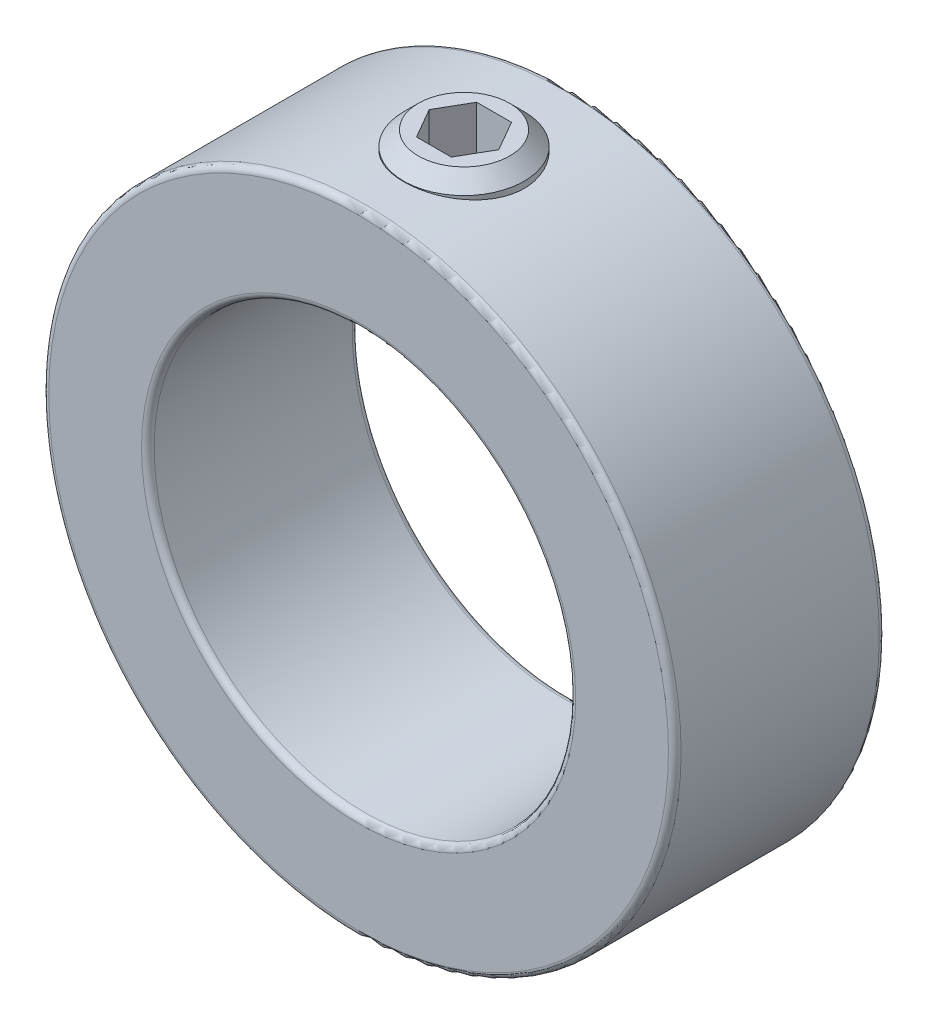
ISO-10303-21;
HEADER;
FILE_DESCRIPTION(('STEP AP214'),'2;1');
FILE_NAME('part.step','',(''),(''),'','','');
FILE_SCHEMA(('AUTOMOTIVE_DESIGN { 1 0 10303 214 1 1 1 1 }'));
ENDSEC;
DATA;
#1=APPLICATION_CONTEXT('core data for automotive mechanical design processes');
#2=APPLICATION_PROTOCOL_DEFINITION('international standard','automotive_design',2000,#1);
#3=PRODUCT_CONTEXT('',#1,'mechanical');
#4=PRODUCT('Part','Part','',(#3));
#5=PRODUCT_RELATED_PRODUCT_CATEGORY('part','',(#4));
#6=PRODUCT_DEFINITION_FORMATION('','',#4);
#7=PRODUCT_DEFINITION_CONTEXT('part definition',#1,'design');
#8=PRODUCT_DEFINITION('design','',#6,#7);
#9=PRODUCT_DEFINITION_SHAPE('','',#8);
#10=(LENGTH_UNIT() NAMED_UNIT(*) SI_UNIT(.MILLI.,.METRE.));
#11=(NAMED_UNIT(*) PLANE_ANGLE_UNIT() SI_UNIT($,.RADIAN.));
#12=(NAMED_UNIT(*) SI_UNIT($,.STERADIAN.) SOLID_ANGLE_UNIT());
#13=UNCERTAINTY_MEASURE_WITH_UNIT(LENGTH_MEASURE(1.E-05),#10,'distance_accuracy_value','');
#14=(GEOMETRIC_REPRESENTATION_CONTEXT(3) GLOBAL_UNCERTAINTY_ASSIGNED_CONTEXT((#13)) GLOBAL_UNIT_ASSIGNED_CONTEXT((#10,
#11,#12)) REPRESENTATION_CONTEXT('',''));
#15=CARTESIAN_POINT('',(0.,0.,0.));
#16=DIRECTION('',(0.,0.,1.));
#17=DIRECTION('',(1.,0.,0.));
#18=AXIS2_PLACEMENT_3D('',#15,#16,#17);
#19=CARTESIAN_POINT('',(0.,34.925,0.));
#20=DIRECTION('',(0.,1.,0.));
#21=DIRECTION('',(-1.,0.,0.));
#22=AXIS2_PLACEMENT_3D('',#19,#20,#21);
#23=PLANE('',#22);
#24=CARTESIAN_POINT('',(0.,34.925,0.));
#25=DIRECTION('',(0.,1.,0.));
#26=DIRECTION('',(-1.,0.,0.));
#27=AXIS2_PLACEMENT_3D('',#24,#25,#26);
#28=CIRCLE('',#27,4.81638526248807);
#29=CARTESIAN_POINT('',(-4.81638526248807,34.925,0.));
#30=VERTEX_POINT('',#29);
#31=EDGE_CURVE('E116',#30,#30,#28,.T.);
#32=ORIENTED_EDGE('',*,*,#31,.T.);
#33=EDGE_LOOP('',(#32));
#34=FACE_BOUND('',#33,.T.);
#35=DIRECTION('',(1.,0.,0.));
#36=VECTOR('',#35,1.);
#37=CARTESIAN_POINT('',(-1.83308710467706,34.925,-3.175));
#38=LINE('',#37,#36);
#39=CARTESIAN_POINT('',(-1.83308710467706,34.925,-3.175));
#40=VERTEX_POINT('',#39);
#41=CARTESIAN_POINT('',(1.83308710467706,34.925,-3.175));
#42=VERTEX_POINT('',#41);
#43=EDGE_CURVE('E111',#40,#42,#38,.T.);
#44=ORIENTED_EDGE('',*,*,#43,.T.);
#45=DIRECTION('',(0.5,0.,0.866025403784438));
#46=VECTOR('',#45,1.);
#47=CARTESIAN_POINT('',(1.83308710467706,34.925,-3.175));
#48=LINE('',#47,#46);
#49=CARTESIAN_POINT('',(3.66617420935412,34.925,0.));
#50=VERTEX_POINT('',#49);
#51=EDGE_CURVE('E57',#42,#50,#48,.T.);
#52=ORIENTED_EDGE('',*,*,#51,.T.);
#53=DIRECTION('',(-0.5,0.,0.866025403784439));
#54=VECTOR('',#53,1.);
#55=CARTESIAN_POINT('',(3.66617420935412,34.925,0.));
#56=LINE('',#55,#54);
#57=CARTESIAN_POINT('',(1.83308710467706,34.925,3.175));
#58=VERTEX_POINT('',#57);
#59=EDGE_CURVE('E115',#50,#58,#56,.T.);
#60=ORIENTED_EDGE('',*,*,#59,.T.);
#61=DIRECTION('',(-1.,0.,0.));
#62=VECTOR('',#61,1.);
#63=CARTESIAN_POINT('',(1.83308710467706,34.925,3.175));
#64=LINE('',#63,#62);
#65=CARTESIAN_POINT('',(-1.83308710467706,34.925,3.175));
#66=VERTEX_POINT('',#65);
#67=EDGE_CURVE('E273',#58,#66,#64,.T.);
#68=ORIENTED_EDGE('',*,*,#67,.T.);
#69=DIRECTION('',(-0.5,0.,-0.866025403784439));
#70=VECTOR('',#69,1.);
#71=CARTESIAN_POINT('',(-1.83308710467706,34.925,3.175));
#72=LINE('',#71,#70);
#73=CARTESIAN_POINT('',(-3.66617420935412,34.925,0.));
#74=VERTEX_POINT('',#73);
#75=EDGE_CURVE('E270',#66,#74,#72,.T.);
#76=ORIENTED_EDGE('',*,*,#75,.T.);
#77=DIRECTION('',(0.5,0.,-0.866025403784439));
#78=VECTOR('',#77,1.);
#79=CARTESIAN_POINT('',(-3.66617420935412,34.925,0.));
#80=LINE('',#79,#78);
#81=EDGE_CURVE('E264',#74,#40,#80,.T.);
#82=ORIENTED_EDGE('',*,*,#81,.T.);
#83=EDGE_LOOP('',(#44,#52,#60,#68,#76,#82));
#84=FACE_BOUND('',#83,.T.);
#85=ADVANCED_FACE('F42',(#34,#84),#23,.T.);
#86=CARTESIAN_POINT('',(0.,22.225,0.));
#87=DIRECTION('',(0.,-1.,0.));
#88=DIRECTION('',(1.,0.,0.));
#89=AXIS2_PLACEMENT_3D('',#86,#87,#88);
#90=CONICAL_SURFACE('',#89,1.84033768501431,0.785398163397448);
#91=CARTESIAN_POINT('',(0.,24.0653376850143,0.));
#92=VERTEX_POINT('',#91);
#93=VERTEX_LOOP('',#92);
#94=FACE_BOUND('',#93,.T.);
#95=CARTESIAN_POINT('',(0.,22.225,0.));
#96=DIRECTION('',(0.,1.,0.));
#97=DIRECTION('',(-1.,0.,0.));
#98=AXIS2_PLACEMENT_3D('',#95,#96,#97);
#99=CIRCLE('',#98,1.84033768501431);
#100=CARTESIAN_POINT('',(-1.84033768501431,22.225,0.));
#101=VERTEX_POINT('',#100);
#102=EDGE_CURVE('E12',#101,#101,#99,.T.);
#103=ORIENTED_EDGE('',*,*,#102,.F.);
#104=EDGE_LOOP('',(#103));
#105=FACE_BOUND('',#104,.T.);
#106=ADVANCED_FACE('F44',(#94,#105),#90,.F.);
#107=CARTESIAN_POINT('',(-4.81638526248807,22.225,0.));
#108=DIRECTION('',(0.,-1.,0.));
#109=DIRECTION('',(1.,0.,0.));
#110=AXIS2_PLACEMENT_3D('',#107,#108,#109);
#111=PLANE('',#110);
#112=ORIENTED_EDGE('',*,*,#102,.T.);
#113=EDGE_LOOP('',(#112));
#114=FACE_BOUND('',#113,.T.);
#115=CARTESIAN_POINT('',(0.,22.225,0.));
#116=DIRECTION('',(0.,1.,0.));
#117=DIRECTION('',(-1.,0.,0.));
#118=AXIS2_PLACEMENT_3D('',#115,#116,#117);
#119=CIRCLE('',#118,4.81638526248807);
#120=CARTESIAN_POINT('',(-4.81638526248807,22.225,0.));
#121=VERTEX_POINT('',#120);
#122=EDGE_CURVE('E50',#121,#121,#119,.T.);
#123=ORIENTED_EDGE('',*,*,#122,.F.);
#124=EDGE_LOOP('',(#123));
#125=FACE_BOUND('',#124,.T.);
#126=ADVANCED_FACE('F136',(#114,#125),#111,.T.);
#127=CARTESIAN_POINT('',(0.,23.7586147375119,0.));
#128=DIRECTION('',(0.,1.,0.));
#129=DIRECTION('',(-1.,0.,0.));
#130=AXIS2_PLACEMENT_3D('',#127,#128,#129);
#131=CONICAL_SURFACE('',#130,6.35,0.785398163397448);
#132=ORIENTED_EDGE('',*,*,#122,.T.);
#133=EDGE_LOOP('',(#132));
#134=FACE_BOUND('',#133,.T.);
#135=CARTESIAN_POINT('',(0.,23.7586147375119,0.));
#136=DIRECTION('',(0.,1.,0.));
#137=DIRECTION('',(-1.,0.,0.));
#138=AXIS2_PLACEMENT_3D('',#135,#136,#137);
#139=CIRCLE('',#138,6.35);
#140=CARTESIAN_POINT('',(-6.35,23.7586147375119,0.));
#141=VERTEX_POINT('',#140);
#142=EDGE_CURVE('E128',#141,#141,#139,.T.);
#143=ORIENTED_EDGE('',*,*,#142,.F.);
#144=EDGE_LOOP('',(#143));
#145=FACE_BOUND('',#144,.T.);
#146=ADVANCED_FACE('F133',(#134,#145),#131,.T.);
#147=CARTESIAN_POINT('',(0.,22.225,0.));
#148=DIRECTION('',(0.,1.,0.));
#149=DIRECTION('',(-1.,0.,0.));
#150=AXIS2_PLACEMENT_3D('',#147,#148,#149);
#151=CYLINDRICAL_SURFACE('',#150,6.35);
#152=ORIENTED_EDGE('',*,*,#142,.T.);
#153=EDGE_LOOP('',(#152));
#154=FACE_BOUND('',#153,.T.);
#155=CARTESIAN_POINT('',(0.,33.3913852624881,0.));
#156=DIRECTION('',(0.,1.,0.));
#157=DIRECTION('',(-1.,0.,0.));
#158=AXIS2_PLACEMENT_3D('',#155,#156,#157);
#159=CIRCLE('',#158,6.35);
#160=CARTESIAN_POINT('',(-6.35,33.3913852624881,0.));
#161=VERTEX_POINT('',#160);
#162=EDGE_CURVE('E120',#161,#161,#159,.T.);
#163=ORIENTED_EDGE('',*,*,#162,.F.);
#164=EDGE_LOOP('',(#163));
#165=FACE_BOUND('',#164,.T.);
#166=ADVANCED_FACE('F143',(#154,#165),#151,.T.);
#167=CARTESIAN_POINT('',(0.,34.925,0.));
#168=DIRECTION('',(0.,-1.,0.));
#169=DIRECTION('',(1.,0.,0.));
#170=AXIS2_PLACEMENT_3D('',#167,#168,#169);
#171=CONICAL_SURFACE('',#170,4.81638526248807,0.785398163397448);
#172=ORIENTED_EDGE('',*,*,#162,.T.);
#173=EDGE_LOOP('',(#172));
#174=FACE_BOUND('',#173,.T.);
#175=ORIENTED_EDGE('',*,*,#31,.F.);
#176=EDGE_LOOP('',(#175));
#177=FACE_BOUND('',#176,.T.);
#178=ADVANCED_FACE('F154',(#174,#177),#171,.T.);
#179=CARTESIAN_POINT('',(1.83308710467706,28.575,-3.175));
#180=DIRECTION('',(-0.866025403784438,0.,0.5));
#181=DIRECTION('',(0.5,0.,0.866025403784439));
#182=AXIS2_PLACEMENT_3D('',#179,#180,#181);
#183=PLANE('',#182);
#184=ORIENTED_EDGE('',*,*,#51,.F.);
#185=DIRECTION('',(0.,1.,0.));
#186=VECTOR('',#185,1.);
#187=CARTESIAN_POINT('',(1.83308710467706,28.575,-3.175));
#188=LINE('',#187,#186);
#189=CARTESIAN_POINT('',(1.83308710467706,28.575,-3.175));
#190=VERTEX_POINT('',#189);
#191=EDGE_CURVE('E110',#190,#42,#188,.T.);
#192=ORIENTED_EDGE('',*,*,#191,.F.);
#193=DIRECTION('',(0.5,0.,0.866025403784438));
#194=VECTOR('',#193,1.);
#195=CARTESIAN_POINT('',(1.83308710467706,28.575,-3.175));
#196=LINE('',#195,#194);
#197=CARTESIAN_POINT('',(3.66617420935412,28.575,0.));
#198=VERTEX_POINT('',#197);
#199=EDGE_CURVE('E101',#190,#198,#196,.T.);
#200=ORIENTED_EDGE('',*,*,#199,.T.);
#201=DIRECTION('',(0.,1.,0.));
#202=VECTOR('',#201,1.);
#203=CARTESIAN_POINT('',(3.66617420935412,28.575,0.));
#204=LINE('',#203,#202);
#205=EDGE_CURVE('E109',#198,#50,#204,.T.);
#206=ORIENTED_EDGE('',*,*,#205,.T.);
#207=EDGE_LOOP('',(#184,#192,#200,#206));
#208=FACE_BOUND('',#207,.T.);
#209=ADVANCED_FACE('F108',(#208),#183,.T.);
#210=CARTESIAN_POINT('',(3.66617420935412,28.575,0.));
#211=DIRECTION('',(-0.866025403784439,0.,-0.5));
#212=DIRECTION('',(-0.5,0.,0.866025403784439));
#213=AXIS2_PLACEMENT_3D('',#210,#211,#212);
#214=PLANE('',#213);
#215=ORIENTED_EDGE('',*,*,#59,.F.);
#216=ORIENTED_EDGE('',*,*,#205,.F.);
#217=DIRECTION('',(-0.5,0.,0.866025403784439));
#218=VECTOR('',#217,1.);
#219=CARTESIAN_POINT('',(3.66617420935412,28.575,0.));
#220=LINE('',#219,#218);
#221=CARTESIAN_POINT('',(1.83308710467706,28.575,3.175));
#222=VERTEX_POINT('',#221);
#223=EDGE_CURVE('E97',#198,#222,#220,.T.);
#224=ORIENTED_EDGE('',*,*,#223,.T.);
#225=DIRECTION('',(0.,1.,0.));
#226=VECTOR('',#225,1.);
#227=CARTESIAN_POINT('',(1.83308710467706,28.575,3.175));
#228=LINE('',#227,#226);
#229=EDGE_CURVE('E117',#222,#58,#228,.T.);
#230=ORIENTED_EDGE('',*,*,#229,.T.);
#231=EDGE_LOOP('',(#215,#216,#224,#230));
#232=FACE_BOUND('',#231,.T.);
#233=ADVANCED_FACE('F113',(#232),#214,.T.);
#234=CARTESIAN_POINT('',(1.83308710467706,28.575,3.175));
#235=DIRECTION('',(0.,0.,-1.));
#236=DIRECTION('',(-1.,0.,0.));
#237=AXIS2_PLACEMENT_3D('',#234,#235,#236);
#238=PLANE('',#237);
#239=ORIENTED_EDGE('',*,*,#67,.F.);
#240=ORIENTED_EDGE('',*,*,#229,.F.);
#241=DIRECTION('',(-1.,0.,0.));
#242=VECTOR('',#241,1.);
#243=CARTESIAN_POINT('',(1.83308710467706,28.575,3.175));
#244=LINE('',#243,#242);
#245=CARTESIAN_POINT('',(-1.83308710467706,28.575,3.175));
#246=VERTEX_POINT('',#245);
#247=EDGE_CURVE('E103',#222,#246,#244,.T.);
#248=ORIENTED_EDGE('',*,*,#247,.T.);
#249=DIRECTION('',(0.,1.,0.));
#250=VECTOR('',#249,1.);
#251=CARTESIAN_POINT('',(-1.83308710467706,28.575,3.175));
#252=LINE('',#251,#250);
#253=EDGE_CURVE('E122',#246,#66,#252,.T.);
#254=ORIENTED_EDGE('',*,*,#253,.T.);
#255=EDGE_LOOP('',(#239,#240,#248,#254));
#256=FACE_BOUND('',#255,.T.);
#257=ADVANCED_FACE('F184',(#256),#238,.T.);
#258=CARTESIAN_POINT('',(-1.83308710467706,28.575,3.175));
#259=DIRECTION('',(0.866025403784439,0.,-0.5));
#260=DIRECTION('',(-0.5,0.,-0.866025403784439));
#261=AXIS2_PLACEMENT_3D('',#258,#259,#260);
#262=PLANE('',#261);
#263=ORIENTED_EDGE('',*,*,#75,.F.);
#264=ORIENTED_EDGE('',*,*,#253,.F.);
#265=DIRECTION('',(-0.5,0.,-0.866025403784439));
#266=VECTOR('',#265,1.);
#267=CARTESIAN_POINT('',(-1.83308710467706,28.575,3.175));
#268=LINE('',#267,#266);
#269=CARTESIAN_POINT('',(-3.66617420935412,28.575,0.));
#270=VERTEX_POINT('',#269);
#271=EDGE_CURVE('E289',#246,#270,#268,.T.);
#272=ORIENTED_EDGE('',*,*,#271,.T.);
#273=DIRECTION('',(0.,1.,0.));
#274=VECTOR('',#273,1.);
#275=CARTESIAN_POINT('',(-3.66617420935412,28.575,0.));
#276=LINE('',#275,#274);
#277=EDGE_CURVE('E280',#270,#74,#276,.T.);
#278=ORIENTED_EDGE('',*,*,#277,.T.);
#279=EDGE_LOOP('',(#263,#264,#272,#278));
#280=FACE_BOUND('',#279,.T.);
#281=ADVANCED_FACE('F190',(#280),#262,.T.);
#282=CARTESIAN_POINT('',(-3.66617420935412,28.575,0.));
#283=DIRECTION('',(0.866025403784439,0.,0.5));
#284=DIRECTION('',(0.5,0.,-0.866025403784439));
#285=AXIS2_PLACEMENT_3D('',#282,#283,#284);
#286=PLANE('',#285);
#287=ORIENTED_EDGE('',*,*,#81,.F.);
#288=ORIENTED_EDGE('',*,*,#277,.F.);
#289=DIRECTION('',(0.5,0.,-0.866025403784439));
#290=VECTOR('',#289,1.);
#291=CARTESIAN_POINT('',(-3.66617420935412,28.575,0.));
#292=LINE('',#291,#290);
#293=CARTESIAN_POINT('',(-1.83308710467706,28.575,-3.175));
#294=VERTEX_POINT('',#293);
#295=EDGE_CURVE('E287',#270,#294,#292,.T.);
#296=ORIENTED_EDGE('',*,*,#295,.T.);
#297=DIRECTION('',(0.,1.,0.));
#298=VECTOR('',#297,1.);
#299=CARTESIAN_POINT('',(-1.83308710467706,28.575,-3.175));
#300=LINE('',#299,#298);
#301=EDGE_CURVE('E263',#294,#40,#300,.T.);
#302=ORIENTED_EDGE('',*,*,#301,.T.);
#303=EDGE_LOOP('',(#287,#288,#296,#302));
#304=FACE_BOUND('',#303,.T.);
#305=ADVANCED_FACE('F198',(#304),#286,.T.);
#306=CARTESIAN_POINT('',(-1.83308710467706,28.575,-3.175));
#307=DIRECTION('',(0.,0.,1.));
#308=DIRECTION('',(1.,0.,0.));
#309=AXIS2_PLACEMENT_3D('',#306,#307,#308);
#310=PLANE('',#309);
#311=ORIENTED_EDGE('',*,*,#43,.F.);
#312=ORIENTED_EDGE('',*,*,#301,.F.);
#313=DIRECTION('',(1.,0.,0.));
#314=VECTOR('',#313,1.);
#315=CARTESIAN_POINT('',(-1.83308710467706,28.575,-3.175));
#316=LINE('',#315,#314);
#317=EDGE_CURVE('E278',#294,#190,#316,.T.);
#318=ORIENTED_EDGE('',*,*,#317,.T.);
#319=ORIENTED_EDGE('',*,*,#191,.T.);
#320=EDGE_LOOP('',(#311,#312,#318,#319));
#321=FACE_BOUND('',#320,.T.);
#322=ADVANCED_FACE('F206',(#321),#310,.T.);
#323=CARTESIAN_POINT('',(3.66617420935412,28.575,0.));
#324=DIRECTION('',(0.,-1.,0.));
#325=DIRECTION('',(0.,0.,-1.));
#326=AXIS2_PLACEMENT_3D('',#323,#324,#325);
#327=PLANE('',#326);
#328=ORIENTED_EDGE('',*,*,#199,.F.);
#329=ORIENTED_EDGE('',*,*,#317,.F.);
#330=ORIENTED_EDGE('',*,*,#295,.F.);
#331=ORIENTED_EDGE('',*,*,#271,.F.);
#332=ORIENTED_EDGE('',*,*,#247,.F.);
#333=ORIENTED_EDGE('',*,*,#223,.F.);
#334=EDGE_LOOP('',(#328,#329,#330,#331,#332,#333));
#335=FACE_BOUND('',#334,.T.);
#336=ADVANCED_FACE('F99',(#335),#327,.F.);
#337=CLOSED_SHELL('',(#85,#106,#126,#146,#166,#178,#209,#233,#257,#281,#305,#322,#336));
#338=MANIFOLD_SOLID_BREP('B2',#337);
#339=CARTESIAN_POINT('',(0.,0.,11.1125));
#340=DIRECTION('',(0.,0.,1.));
#341=DIRECTION('',(1.,0.,0.));
#342=AXIS2_PLACEMENT_3D('',#339,#340,#341);
#343=PLANE('',#342);
#344=CARTESIAN_POINT('',(0.,0.,11.1125));
#345=DIRECTION('',(0.,0.,1.));
#346=DIRECTION('',(1.,0.,0.));
#347=AXIS2_PLACEMENT_3D('',#344,#345,#346);
#348=CIRCLE('',#347,22.89175);
#349=CARTESIAN_POINT('',(22.89175,0.,11.1125));
#350=VERTEX_POINT('',#349);
#351=EDGE_CURVE('E307',#350,#350,#348,.F.);
#352=ORIENTED_EDGE('',*,*,#351,.T.);
#353=EDGE_LOOP('',(#352));
#354=FACE_BOUND('',#353,.T.);
#355=CARTESIAN_POINT('',(0.,0.,11.1125));
#356=DIRECTION('',(0.,0.,1.));
#357=DIRECTION('',(1.,0.,0.));
#358=AXIS2_PLACEMENT_3D('',#355,#356,#357);
#359=CIRCLE('',#358,32.67075);
#360=CARTESIAN_POINT('',(32.67075,0.,11.1125));
#361=VERTEX_POINT('',#360);
#362=EDGE_CURVE('E311',#361,#361,#359,.T.);
#363=ORIENTED_EDGE('',*,*,#362,.T.);
#364=EDGE_LOOP('',(#363));
#365=FACE_BOUND('',#364,.T.);
#366=ADVANCED_FACE('F296',(#354,#365),#343,.T.);
#367=CARTESIAN_POINT('',(0.,0.,-11.1125));
#368=DIRECTION('',(0.,0.,1.));
#369=DIRECTION('',(1.,0.,0.));
#370=AXIS2_PLACEMENT_3D('',#367,#368,#369);
#371=PLANE('',#370);
#372=CARTESIAN_POINT('',(0.,0.,-11.1125));
#373=DIRECTION('',(0.,0.,1.));
#374=DIRECTION('',(1.,0.,0.));
#375=AXIS2_PLACEMENT_3D('',#372,#373,#374);
#376=CIRCLE('',#375,22.89175);
#377=CARTESIAN_POINT('',(22.89175,0.,-11.1125));
#378=VERTEX_POINT('',#377);
#379=EDGE_CURVE('E322',#378,#378,#376,.T.);
#380=ORIENTED_EDGE('',*,*,#379,.T.);
#381=EDGE_LOOP('',(#380));
#382=FACE_BOUND('',#381,.T.);
#383=CARTESIAN_POINT('',(0.,0.,-11.1125));
#384=DIRECTION('',(0.,0.,1.));
#385=DIRECTION('',(1.,0.,0.));
#386=AXIS2_PLACEMENT_3D('',#383,#384,#385);
#387=CIRCLE('',#386,32.67075);
#388=CARTESIAN_POINT('',(32.67075,0.,-11.1125));
#389=VERTEX_POINT('',#388);
#390=EDGE_CURVE('E325',#389,#389,#387,.F.);
#391=ORIENTED_EDGE('',*,*,#390,.T.);
#392=EDGE_LOOP('',(#391));
#393=FACE_BOUND('',#392,.T.);
#394=ADVANCED_FACE('F359',(#382,#393),#371,.F.);
#395=CARTESIAN_POINT('',(0.,0.,11.1125));
#396=DIRECTION('',(0.,0.,-1.));
#397=DIRECTION('',(-1.,0.,0.));
#398=AXIS2_PLACEMENT_3D('',#395,#396,#397);
#399=CYLINDRICAL_SURFACE('',#398,33.3375);
#400=CARTESIAN_POINT('',(0.,0.,-10.44575));
#401=DIRECTION('',(0.,0.,1.));
#402=DIRECTION('',(1.,0.,0.));
#403=AXIS2_PLACEMENT_3D('',#400,#401,#402);
#404=CIRCLE('',#403,33.3375);
#405=CARTESIAN_POINT('',(33.3375,0.,-10.44575));
#406=VERTEX_POINT('',#405);
#407=EDGE_CURVE('E41',#406,#406,#404,.T.);
#408=ORIENTED_EDGE('',*,*,#407,.T.);
#409=EDGE_LOOP('',(#408));
#410=FACE_BOUND('',#409,.T.);
#411=CARTESIAN_POINT('',(0.,0.,10.44575));
#412=DIRECTION('',(0.,0.,1.));
#413=DIRECTION('',(1.,0.,0.));
#414=AXIS2_PLACEMENT_3D('',#411,#412,#413);
#415=CIRCLE('',#414,33.3375);
#416=CARTESIAN_POINT('',(33.3375,0.,10.44575));
#417=VERTEX_POINT('',#416);
#418=EDGE_CURVE('E303',#417,#417,#415,.F.);
#419=ORIENTED_EDGE('',*,*,#418,.T.);
#420=EDGE_LOOP('',(#419));
#421=FACE_BOUND('',#420,.T.);
#422=CARTESIAN_POINT('',(0.,33.3375,-6.35));
#423=CARTESIAN_POINT('',(0.176689159375236,33.3375015929536,-6.35000326681955));
#424=CARTESIAN_POINT('',(0.353336439264915,33.3360928332348,-6.34262339713145));
#425=CARTESIAN_POINT('',(0.705410637272575,33.3305005971835,-6.31316795001832));
#426=CARTESIAN_POINT('',(0.880837332946361,33.3263166278114,-6.29108976130899));
#427=CARTESIAN_POINT('',(1.22924802105671,33.3152857302707,-6.23238977978562));
#428=CARTESIAN_POINT('',(1.40223061199315,33.3084373337519,-6.19575996742086));
#429=CARTESIAN_POINT('',(1.74449596187487,33.292266392806,-6.10822767367177));
#430=CARTESIAN_POINT('',(1.91377733699645,33.2829429395558,-6.05731994915101));
#431=CARTESIAN_POINT('',(2.24716953292926,33.2620955395185,-5.94170172742252));
#432=CARTESIAN_POINT('',(2.41128678541993,33.2505744672695,-5.87700924820096));
#433=CARTESIAN_POINT('',(2.73351265888294,33.2256367942364,-5.73423696752915));
#434=CARTESIAN_POINT('',(2.89161903821914,33.2122194949232,-5.65615223038529));
#435=CARTESIAN_POINT('',(3.20061741665399,33.1838668354031,-5.48721597604944));
#436=CARTESIAN_POINT('',(3.35151271129233,33.1689321785908,-5.39637036695217));
#437=CARTESIAN_POINT('',(3.64521470014658,33.1379409986075,-5.20248832324675));
#438=CARTESIAN_POINT('',(3.78801834892557,33.1218840580567,-5.09944734316874));
#439=CARTESIAN_POINT('',(4.06601015304467,33.0889146350617,-4.88074503065648));
#440=CARTESIAN_POINT('',(4.20110058194174,33.071994841906,-4.76496056395035));
#441=CARTESIAN_POINT('',(4.46112695344401,33.0379245282795,-4.52244026350887));
#442=CARTESIAN_POINT('',(4.58605911564546,33.0207739246548,-4.39570038858559));
#443=CARTESIAN_POINT('',(4.8248298946151,32.9867316569753,-4.13220486649153));
#444=CARTESIAN_POINT('',(4.93867175504195,32.9698399184338,-3.99545216846212));
#445=CARTESIAN_POINT('',(5.15455931781682,32.93677819778,-3.71276983889861));
#446=CARTESIAN_POINT('',(5.25660065405069,32.9206084841617,-3.56683684135346));
#447=CARTESIAN_POINT('',(5.44887257909532,32.889333534656,-3.26564768093359));
#448=CARTESIAN_POINT('',(5.53900429357244,32.8742376387489,-3.11032739113257));
#449=CARTESIAN_POINT('',(5.7058774483697,32.8456852128023,-2.79243760675268));
#450=CARTESIAN_POINT('',(5.78261387174994,32.832229297552,-2.62986542462079));
#451=CARTESIAN_POINT('',(5.92204543526591,32.8073667987222,-2.29871961944271));
#452=CARTESIAN_POINT('',(5.9847467478999,32.7959593147018,-2.1301486725455));
#453=CARTESIAN_POINT('',(6.09568189087405,32.7755197662875,-1.78817290206117));
#454=CARTESIAN_POINT('',(6.14391046219096,32.7664885655205,-1.61476634629274));
#455=CARTESIAN_POINT('',(6.26521993690781,32.7435959420035,-1.09333816903531));
#456=CARTESIAN_POINT('',(6.31675605056767,32.7335971366642,-0.739742615961478));
#457=CARTESIAN_POINT('',(6.34913045390294,32.7273184044428,-0.207110284988137));
#458=CARTESIAN_POINT('',(6.35242580167642,32.726680258912,-0.0291200296550647));
#459=CARTESIAN_POINT('',(6.34409157832036,32.7282971791847,0.326519455761896));
#460=CARTESIAN_POINT('',(6.33246176691981,32.730552291565,0.504168680309629));
#461=CARTESIAN_POINT('',(6.27574259787048,32.741498789712,1.02972592521104));
#462=CARTESIAN_POINT('',(6.20912960306562,32.7543134863134,1.37546860634504));
#463=CARTESIAN_POINT('',(6.02001854210324,32.789592110232,2.05059847703264));
#464=CARTESIAN_POINT('',(5.89751803244615,32.8120564594464,2.37998495076604));
#465=CARTESIAN_POINT('',(5.59932158539112,32.8642581718204,3.01563203873575));
#466=CARTESIAN_POINT('',(5.42330184421858,32.894039588318,3.32173729474531));
#467=CARTESIAN_POINT('',(5.02329354874309,32.9574924343925,3.90035691033708));
#468=CARTESIAN_POINT('',(4.79929997574463,32.9911642707889,4.17286775079732));
#469=CARTESIAN_POINT('',(4.30536694540527,33.0592761279164,4.68123142434072));
#470=CARTESIAN_POINT('',(4.03473898417003,33.093719731447,4.91641539023951));
#471=CARTESIAN_POINT('',(3.45751955868705,33.1589910580975,5.33814759055498));
#472=CARTESIAN_POINT('',(3.1509277116763,33.1898187427262,5.52469530726879));
#473=CARTESIAN_POINT('',(2.50977521418786,33.2444500289453,5.84396523629114));
#474=CARTESIAN_POINT('',(2.17517827915953,33.2682443312092,5.97661627400789));
#475=CARTESIAN_POINT('',(1.48789624909867,33.3060563414164,6.18364215283533));
#476=CARTESIAN_POINT('',(1.13521314260325,33.3200751216945,6.2580233860162));
#477=CARTESIAN_POINT('',(0.427523600937189,33.3366087780301,6.34546357178205));
#478=CARTESIAN_POINT('',(0.0726342646943071,33.3392955294893,6.35943879729734));
#479=CARTESIAN_POINT('',(-0.634409807238231,33.3333377861446,6.32813024649413));
#480=CARTESIAN_POINT('',(-0.986564680851963,33.3246938666344,6.28284947878864));
#481=CARTESIAN_POINT('',(-1.67522550964687,33.2971531828658,6.13507630477305));
#482=CARTESIAN_POINT('',(-2.01183490326582,33.2783398114185,6.03304904384963));
#483=CARTESIAN_POINT('',(-2.66317011515254,33.2325611982176,5.77518232585852));
#484=CARTESIAN_POINT('',(-2.9778944090501,33.2055953893177,5.61933912483253));
#485=CARTESIAN_POINT('',(-3.58042404617568,33.1460745065967,5.2562516533002));
#486=CARTESIAN_POINT('',(-3.86788715617858,33.1134600304959,5.0484494607194));
#487=CARTESIAN_POINT('',(-4.40419423479706,33.0464091843582,4.58807841293372));
#488=CARTESIAN_POINT('',(-4.6530344693599,33.011972638595,4.33550523432804));
#489=CARTESIAN_POINT('',(-5.10850935498122,32.9445880681881,3.78867395349885));
#490=CARTESIAN_POINT('',(-5.31451763351583,32.9116669716931,3.4938911445587));
#491=CARTESIAN_POINT('',(-5.67413886792462,32.8515830498438,2.87316691311025));
#492=CARTESIAN_POINT('',(-5.82775380847459,32.8244200063874,2.54722667145404));
#493=CARTESIAN_POINT('',(-6.01499015683048,32.7904359904148,2.04315583358626));
#494=CARTESIAN_POINT('',(-6.07013872536032,32.7802480917389,1.87295262552884));
#495=CARTESIAN_POINT('',(-6.16590800124732,32.7623699936426,1.52839424678085));
#496=CARTESIAN_POINT('',(-6.2065340094017,32.7546788829782,1.35404061584803));
#497=CARTESIAN_POINT('',(-6.27293203247137,32.7420275403896,1.00242438777552));
#498=CARTESIAN_POINT('',(-6.298702634312,32.7370675682586,0.825161515552098));
#499=CARTESIAN_POINT('',(-6.3351823178803,32.7300278004572,0.469037470413165));
#500=CARTESIAN_POINT('',(-6.34589193784665,32.7279479018608,0.29017635484444));
#501=CARTESIAN_POINT('',(-6.3521098784709,32.7267415782532,-0.0648800878622852));
#502=CARTESIAN_POINT('',(-6.34786476226399,32.7275672480396,-0.241070996759181));
#503=CARTESIAN_POINT('',(-6.324752914738,32.7320415670328,-0.592452375787748));
#504=CARTESIAN_POINT('',(-6.30588645265553,32.7356901642585,-0.767642864281265));
#505=CARTESIAN_POINT('',(-6.25367673563724,32.7457041208259,-1.11580411411534));
#506=CARTESIAN_POINT('',(-6.22033098656731,32.7520699482218,-1.28877448774197));
#507=CARTESIAN_POINT('',(-6.13943684105929,32.7673299593886,-1.63118086309977));
#508=CARTESIAN_POINT('',(-6.09189352456771,32.7762232387722,-1.80061810583985));
#509=CARTESIAN_POINT('',(-5.98305281409414,32.7962656261274,-2.13456562569489));
#510=CARTESIAN_POINT('',(-5.92177828818484,32.807410980475,-2.29908358495181));
#511=CARTESIAN_POINT('',(-5.78590887847834,32.8316451234449,-2.62230455367621));
#512=CARTESIAN_POINT('',(-5.71131872479994,32.844733221668,-2.78100960401828));
#513=CARTESIAN_POINT('',(-5.54930663120308,32.8724939089745,-3.09166581671066));
#514=CARTESIAN_POINT('',(-5.46187945216892,32.8871671443435,-3.24361418834374));
#515=CARTESIAN_POINT('',(-5.27486068947625,32.9176809759628,-3.53963069399937));
#516=CARTESIAN_POINT('',(-5.17527331125295,32.9335211678899,-3.68370152754308));
#517=CARTESIAN_POINT('',(-4.96292048380551,32.9661954800895,-3.96528756957323));
#518=CARTESIAN_POINT('',(-4.84997152714609,32.9830413577007,-4.10266306173955));
#519=CARTESIAN_POINT('',(-4.61301617636884,33.0170153750753,-4.36739382865825));
#520=CARTESIAN_POINT('',(-4.4890137005728,33.0341434130751,-4.49475262429511));
#521=CARTESIAN_POINT('',(-4.23068098748235,33.0682207621258,-4.73871501021789));
#522=CARTESIAN_POINT('',(-4.09634466808424,33.0851699611421,-4.85531217643899));
#523=CARTESIAN_POINT('',(-3.81836738124498,33.1184021341966,-5.07682420906197));
#524=CARTESIAN_POINT('',(-3.67472986006248,33.1346853513852,-5.1817433636384));
#525=CARTESIAN_POINT('',(-3.37763359792605,33.1662934998679,-5.38017751370228));
#526=CARTESIAN_POINT('',(-3.22409284213131,33.1816075558479,-5.47357151236197));
#527=CARTESIAN_POINT('',(-2.90959337559354,33.2106624639917,-5.64703518805606));
#528=CARTESIAN_POINT('',(-2.74863742483426,33.2244038949667,-5.72710977230831));
#529=CARTESIAN_POINT('',(-2.42048285709737,33.2499206274382,-5.87332968203568));
#530=CARTESIAN_POINT('',(-2.25328826624692,33.2616971710193,-5.9394838141521));
#531=CARTESIAN_POINT('',(-1.91381603588314,33.2829560080692,-6.05740085353176));
#532=CARTESIAN_POINT('',(-1.74153941737737,33.2924387588989,-6.1091666300063));
#533=CARTESIAN_POINT('',(-1.31173040265309,33.3126638947124,-6.218628885625));
#534=CARTESIAN_POINT('',(-1.051914011529,33.3219305832669,-6.26782856133074));
#535=CARTESIAN_POINT('',(-0.528033846106513,33.334347363902,-6.33351123916155));
#536=CARTESIAN_POINT('',(-0.263970186003931,33.3374976201582,-6.34999511943478));
#537=CARTESIAN_POINT('',(0.,33.3375,-6.35));
#538=B_SPLINE_CURVE_WITH_KNOTS('',3,(#422,#423,#424,#425,#426,#427,#428,#429,#430,#431,#432,
#433,#434,#435,#436,#437,#438,#439,#440,#441,#442,#443,#444,#445,#446,#447,#448,#449,#450,#451,
#452,#453,#454,#455,#456,#457,#458,#459,#460,#461,#462,#463,#464,#465,#466,#467,#468,#469,#470,
#471,#472,#473,#474,#475,#476,#477,#478,#479,#480,#481,#482,#483,#484,#485,#486,#487,#488,#489,
#490,#491,#492,#493,#494,#495,#496,#497,#498,#499,#500,#501,#502,#503,#504,#505,#506,#507,#508,
#509,#510,#511,#512,#513,#514,#515,#516,#517,#518,#519,#520,#521,#522,#523,#524,#525,#526,#527,
#528,#529,#530,#531,#532,#533,#534,#535,#536,#537),.UNSPECIFIED.,.T.,.F.,(4,2,2,2,2,2,2,2,2,2,2,
2,2,2,2,2,2,2,2,2,2,2,2,2,2,2,2,2,2,2,2,2,2,2,2,2,2,2,2,2,2,2,2,2,2,2,2,2,2,2,2,2,2,2,2,2,2,4),
(0.,0.529835817331434,1.05976578973596,1.58998821810091,2.12040561031401,2.6501339034472,
3.18005784820945,3.70973724978489,4.23961469938495,4.77515642836835,5.310896555857,
5.84647951824045,6.38226001295426,6.9222412681286,7.46242433064522,8.00236935736333,
8.54251034934366,9.60873047709695,10.1422754989599,10.6758291101455,11.7274378026358,
12.7790924776986,13.837240978538,14.8955002297824,15.970984431631,17.0464800808781,
18.1233914220619,19.2001846118771,20.2605857618316,21.3209330739757,22.3727142597656,
23.4245686323936,24.4882428376311,25.5520198147322,26.6304020216919,27.7087433746632,
28.2458199627016,28.7827003148165,29.319631727594,29.8565439514108,30.384645670282,
30.9127376649496,31.4409206623784,31.9689148997926,32.4960362612113,33.0229707442407,
33.5501208834573,34.0770892287683,34.6123918129531,35.1475053886117,35.6829363573936,
36.2181700623386,36.7586156257506,37.2988616318426,37.8387648220002,38.3785602715955,
39.17014598067,39.9617104419367),.UNSPECIFIED.);
#539=CARTESIAN_POINT('',(0.,33.3375,-6.35));
#540=VERTEX_POINT('',#539);
#541=EDGE_CURVE('E328',#540,#540,#538,.T.);
#542=ORIENTED_EDGE('',*,*,#541,.T.);
#543=EDGE_LOOP('',(#542));
#544=FACE_BOUND('',#543,.T.);
#545=ADVANCED_FACE('F355',(#410,#421,#544),#399,.T.);
#546=CARTESIAN_POINT('',(0.,0.,11.1125));
#547=DIRECTION('',(0.,0.,-1.));
#548=DIRECTION('',(-1.,0.,0.));
#549=AXIS2_PLACEMENT_3D('',#546,#547,#548);
#550=CYLINDRICAL_SURFACE('',#549,22.225);
#551=CARTESIAN_POINT('',(0.,0.,-10.44575));
#552=DIRECTION('',(0.,0.,1.));
#553=DIRECTION('',(1.,0.,0.));
#554=AXIS2_PLACEMENT_3D('',#551,#552,#553);
#555=CIRCLE('',#554,22.225);
#556=CARTESIAN_POINT('',(22.225,0.,-10.44575));
#557=VERTEX_POINT('',#556);
#558=EDGE_CURVE('E316',#557,#557,#555,.F.);
#559=ORIENTED_EDGE('',*,*,#558,.T.);
#560=EDGE_LOOP('',(#559));
#561=FACE_BOUND('',#560,.T.);
#562=CARTESIAN_POINT('',(0.,0.,10.44575));
#563=DIRECTION('',(0.,0.,1.));
#564=DIRECTION('',(1.,0.,0.));
#565=AXIS2_PLACEMENT_3D('',#562,#563,#564);
#566=CIRCLE('',#565,22.225);
#567=CARTESIAN_POINT('',(22.225,0.,10.44575));
#568=VERTEX_POINT('',#567);
#569=EDGE_CURVE('E319',#568,#568,#566,.T.);
#570=ORIENTED_EDGE('',*,*,#569,.T.);
#571=EDGE_LOOP('',(#570));
#572=FACE_BOUND('',#571,.T.);
#573=CARTESIAN_POINT('',(0.,22.225,-6.35));
#574=CARTESIAN_POINT('',(0.174607225843672,22.22500466078,-6.35000700014532));
#575=CARTESIAN_POINT('',(0.349145676414635,22.2229397533426,-6.34279789573995));
#576=CARTESIAN_POINT('',(0.696988519144416,22.2147481167108,-6.3140422802447));
#577=CARTESIAN_POINT('',(0.870292828276677,22.2086211168013,-6.29249481358471));
#578=CARTESIAN_POINT('',(1.21437514514275,22.1924673773701,-6.23524079368351));
#579=CARTESIAN_POINT('',(1.38515279448038,22.182440090011,-6.19953225135234));
#580=CARTESIAN_POINT('',(1.72302009773865,22.1587570214081,-6.11425113451824));
#581=CARTESIAN_POINT('',(1.89010836488564,22.1450999000995,-6.064673439435));
#582=CARTESIAN_POINT('',(2.2190834151464,22.1145548995916,-5.95217069737688));
#583=CARTESIAN_POINT('',(2.3809789965358,22.0976728635879,-5.88926976856384));
#584=CARTESIAN_POINT('',(2.6988690410669,22.0611047907319,-5.7505388175935));
#585=CARTESIAN_POINT('',(2.85486129536684,22.0414177171969,-5.67470401329807));
#586=CARTESIAN_POINT('',(3.15984930758175,21.999764787099,-5.51069970639498));
#587=CARTESIAN_POINT('',(3.30884717023756,21.977799622524,-5.42253394659171));
#588=CARTESIAN_POINT('',(3.59899575566579,21.932156038399,-5.23446873432145));
#589=CARTESIAN_POINT('',(3.74014344013891,21.9084769635531,-5.13456478468176));
#590=CARTESIAN_POINT('',(4.15683584601096,21.8346494476341,-4.81330808065583));
#591=CARTESIAN_POINT('',(4.41865216641729,21.7827038931198,-4.57415879170046));
#592=CARTESIAN_POINT('',(4.89900472413622,21.6797370204422,-4.05551501860422));
#593=CARTESIAN_POINT('',(5.11753447188943,21.6287158419022,-3.77601449581516));
#594=CARTESIAN_POINT('',(5.41037724738394,21.556642164414,-3.32911626893774));
#595=CARTESIAN_POINT('',(5.5029306328732,21.5331428323918,-3.17379633075778));
#596=CARTESIAN_POINT('',(5.67457190710557,21.4885486379579,-2.85558481512168));
#597=CARTESIAN_POINT('',(5.75366509906433,21.4674528296637,-2.69269625199885));
#598=CARTESIAN_POINT('',(5.89777555732772,21.4283095558397,-2.36041473411786));
#599=CARTESIAN_POINT('',(5.96278946902985,21.4102628170218,-2.19102024051745));
#600=CARTESIAN_POINT('',(6.07814329403663,21.3778013854953,-1.84704095357373));
#601=CARTESIAN_POINT('',(6.12848952764155,21.3633851287767,-1.67245843159463));
#602=CARTESIAN_POINT('',(6.21300222204907,21.3389576943167,-1.32380629723984));
#603=CARTESIAN_POINT('',(6.24754512308764,21.3288444796381,-1.1498350410704));
#604=CARTESIAN_POINT('',(6.30196230031208,21.3128295427848,-0.799488799857778));
#605=CARTESIAN_POINT('',(6.3218424154669,21.3069261442212,-0.623114800155221));
#606=CARTESIAN_POINT('',(6.34676930039179,21.2995144157788,-0.269228851590363));
#607=CARTESIAN_POINT('',(6.3518160324456,21.2980060970751,-0.0917168998357876));
#608=CARTESIAN_POINT('',(6.34702771429539,21.2994335853591,0.263086371783537));
#609=CARTESIAN_POINT('',(6.33719294866634,21.3023693073646,0.440377695802407));
#610=CARTESIAN_POINT('',(6.30329952745179,21.3124221459539,0.787622007156848));
#611=CARTESIAN_POINT('',(6.27971560711652,21.3193996571838,0.957625639914477));
#612=CARTESIAN_POINT('',(6.21890625958517,21.3372170797014,1.29502866920454));
#613=CARTESIAN_POINT('',(6.18167618266817,21.348058307457,1.4624271577826));
#614=CARTESIAN_POINT('',(6.09390177541062,21.3732792862705,1.79336549485732));
#615=CARTESIAN_POINT('',(6.04336144410366,21.3876579744218,1.95690648627659));
#616=CARTESIAN_POINT('',(5.92934452393345,21.4195471644876,2.27916620054469));
#617=CARTESIAN_POINT('',(5.86586304528276,21.4370588498921,2.43788307448464));
#618=CARTESIAN_POINT('',(5.72559900968917,21.4749500536338,2.75133765905545));
#619=CARTESIAN_POINT('',(5.64866282309198,21.4953621202636,2.90600266163667));
#620=CARTESIAN_POINT('',(5.48256746702259,21.5383248264677,3.20838301751455));
#621=CARTESIAN_POINT('',(5.39340383819614,21.5608762453356,3.35609580881506));
#622=CARTESIAN_POINT('',(5.20350077301855,21.6074931087347,3.64359080286918));
#623=CARTESIAN_POINT('',(5.10276332237519,21.631558293231,3.78337435990376));
#624=CARTESIAN_POINT('',(4.89031372703301,21.6805752386709,4.05425353951971));
#625=CARTESIAN_POINT('',(4.77859746176929,21.7055273302279,4.18534586896169));
#626=CARTESIAN_POINT('',(4.54054298598351,21.7565957301704,4.44272822295871));
#627=CARTESIAN_POINT('',(4.41381438091844,21.7827207008736,4.5686557450774));
#628=CARTESIAN_POINT('',(4.15010088279959,21.8344990105781,4.80947601772218));
#629=CARTESIAN_POINT('',(4.0131123567854,21.8601521784744,4.92436482633605));
#630=CARTESIAN_POINT('',(3.72981121559586,21.9102674512931,5.1422698920313));
#631=CARTESIAN_POINT('',(3.58349950159207,21.9347296709296,5.24528729389774));
#632=CARTESIAN_POINT('',(3.2824915191909,21.9817896276744,5.43872727472672));
#633=CARTESIAN_POINT('',(3.12779542709758,22.0043874039625,5.52915011838106));
#634=CARTESIAN_POINT('',(2.81011620068694,22.0472153627115,5.69721200719302));
#635=CARTESIAN_POINT('',(2.64709000503635,22.067430971662,5.77477343699455));
#636=CARTESIAN_POINT('',(2.31477969497401,22.1047587984593,5.91581461858759));
#637=CARTESIAN_POINT('',(2.14549787853617,22.1218721425311,5.97929948251466));
#638=CARTESIAN_POINT('',(1.80184247289216,22.1525110172998,6.09167828035247));
#639=CARTESIAN_POINT('',(1.62746898352203,22.1660366182917,6.14057250014169));
#640=CARTESIAN_POINT('',(1.27493292683385,22.1891047201282,6.22332911508259));
#641=CARTESIAN_POINT('',(1.09677047966622,22.1986473470784,6.25719198614599));
#642=CARTESIAN_POINT('',(0.74395272443263,22.2132235092098,6.30870526580559));
#643=CARTESIAN_POINT('',(0.569375730557637,22.2183954670131,6.32685386129398));
#644=CARTESIAN_POINT('',(0.219182329868334,22.2246093389965,6.34864124492978));
#645=CARTESIAN_POINT('',(0.0435655857163433,22.2256498298582,6.35227503263019));
#646=CARTESIAN_POINT('',(-0.307257218845323,22.2235680117226,6.3449871418948));
#647=CARTESIAN_POINT('',(-0.48246343341209,22.2204476578164,6.33407229954738));
#648=CARTESIAN_POINT('',(-0.831313646661246,22.2101329121881,6.29779176666783));
#649=CARTESIAN_POINT('',(-1.00495707846108,22.2029370982117,6.27242103129899));
#650=CARTESIAN_POINT('',(-1.34583724633765,22.1848571496626,6.20811496351392));
#651=CARTESIAN_POINT('',(-1.51313242385072,22.1740512025724,6.16946672798917));
#652=CARTESIAN_POINT('',(-1.84380894047708,22.1490065064468,6.07883701891772));
#653=CARTESIAN_POINT('',(-2.00719021568522,22.1347677014026,6.02685532782797));
#654=CARTESIAN_POINT('',(-2.32899182418067,22.103225306146,5.90995854019694));
#655=CARTESIAN_POINT('',(-2.48741102805871,22.0859210240855,5.8450405236392));
#656=CARTESIAN_POINT('',(-2.79819257020641,22.0487013783144,5.70279020787697));
#657=CARTESIAN_POINT('',(-2.95055670323331,22.0287867959486,5.6254616219966));
#658=CARTESIAN_POINT('',(-3.25161632407704,21.9863874139114,5.45709511274572));
#659=CARTESIAN_POINT('',(-3.40015762640932,21.96385575207,5.36579327838458));
#660=CARTESIAN_POINT('',(-3.68901354818145,21.9171897238231,5.17145740951201));
#661=CARTESIAN_POINT('',(-3.82933083327726,21.8930558822032,5.06842720873921));
#662=CARTESIAN_POINT('',(-4.10100910871132,21.8437959526458,4.85123550798771));
#663=CARTESIAN_POINT('',(-4.23236517184335,21.8186693306413,4.73706796679418));
#664=CARTESIAN_POINT('',(-4.48519196953456,21.7681027164706,4.49841780762353));
#665=CARTESIAN_POINT('',(-4.60666604163568,21.7426628334755,4.37393870118078));
#666=CARTESIAN_POINT('',(-4.84288259165127,21.6912933107398,4.11111071948254));
#667=CARTESIAN_POINT('',(-4.95726865795673,21.6653753733001,3.97243894220334));
#668=CARTESIAN_POINT('',(-5.17392399901037,21.6146596930875,3.6858203476967));
#669=CARTESIAN_POINT('',(-5.27619763987137,21.5898615486744,3.53787690217326));
#670=CARTESIAN_POINT('',(-5.46798433200695,21.5420877905565,3.23357447541479));
#671=CARTESIAN_POINT('',(-5.55749251880891,21.5191128730918,3.07721231719926));
#672=CARTESIAN_POINT('',(-5.72298911056296,21.4756918620206,2.7572314622773));
#673=CARTESIAN_POINT('',(-5.79898304617395,21.4552447349741,2.59361576846113));
#674=CARTESIAN_POINT('',(-5.9365396447661,21.4175905719465,2.26102201194341));
#675=CARTESIAN_POINT('',(-5.99817191871735,21.4003679900347,2.09207452146759));
#676=CARTESIAN_POINT('',(-6.10693814807914,21.3695841992497,1.74931979272723));
#677=CARTESIAN_POINT('',(-6.15407783400497,21.3560215434648,1.57551450501771));
#678=CARTESIAN_POINT('',(-6.23346315011019,21.3329855703873,1.22427626699191));
#679=CARTESIAN_POINT('',(-6.26570961812217,21.3235120230598,1.0468435213284));
#680=CARTESIAN_POINT('',(-6.3150061115508,21.3089649367854,0.68970239783215));
#681=CARTESIAN_POINT('',(-6.33205664749832,21.3038912500184,0.509994096655967));
#682=CARTESIAN_POINT('',(-6.35044160453722,21.2984178243426,0.156552799361354));
#683=CARTESIAN_POINT('',(-6.35234805550104,21.2978479688049,-0.0171480584298028));
#684=CARTESIAN_POINT('',(-6.34192685087219,21.3009534768702,-0.364145272331363));
#685=CARTESIAN_POINT('',(-6.32959431580945,21.3046302957399,-0.537441469374248));
#686=CARTESIAN_POINT('',(-6.29080675631153,21.3161155539105,-0.882233416932272));
#687=CARTESIAN_POINT('',(-6.26435749705272,21.3239223065622,-1.05372987331675));
#688=CARTESIAN_POINT('',(-6.19756182631834,21.3434313350994,-1.39383356452035));
#689=CARTESIAN_POINT('',(-6.15721022914511,21.3551350645375,-1.56243969655175));
#690=CARTESIAN_POINT('',(-6.06345639768137,21.3819426028598,-1.89375915858007));
#691=CARTESIAN_POINT('',(-6.01019706330066,21.3970090481968,-2.05651601256935));
#692=CARTESIAN_POINT('',(-5.89081536445783,21.4301832856134,-2.37698183881957));
#693=CARTESIAN_POINT('',(-5.82468863175085,21.4482921102387,-2.53468907559537));
#694=CARTESIAN_POINT('',(-5.68008093015661,21.4870403960369,-2.8439982482696));
#695=CARTESIAN_POINT('',(-5.60160050110819,21.5076797466209,-2.99560045058593));
#696=CARTESIAN_POINT('',(-5.43283234031519,21.5509290543146,-3.29179104893747));
#697=CARTESIAN_POINT('',(-5.34254418492379,21.5735390821202,-3.43637919306154));
#698=CARTESIAN_POINT('',(-5.1475371317586,21.6209131624242,-3.72240747351869));
#699=CARTESIAN_POINT('',(-5.04243563203111,21.6457240385645,-3.86357912395585));
#700=CARTESIAN_POINT('',(-4.82099597145661,21.6961173737301,-4.1365906870759));
#701=CARTESIAN_POINT('',(-4.70466127448598,21.7216995932405,-4.26843345482747));
#702=CARTESIAN_POINT('',(-4.46140202246055,21.7729642592041,-4.52208892134072));
#703=CARTESIAN_POINT('',(-4.3344713304758,21.7986467554119,-4.64389572524352));
#704=CARTESIAN_POINT('',(-4.07092330829059,21.8493983436695,-4.87657385192751));
#705=CARTESIAN_POINT('',(-3.93430945468407,21.8744676515707,-4.98744906568876));
#706=CARTESIAN_POINT('',(-3.64851861662806,21.9239710421485,-5.20032494661473));
#707=CARTESIAN_POINT('',(-3.49910683664383,21.9483714820997,-5.30201856528958));
#708=CARTESIAN_POINT('',(-3.19198527317931,21.9951352780637,-5.49239139447506));
#709=CARTESIAN_POINT('',(-3.03427855013152,22.0174993771849,-5.5810753597905));
#710=CARTESIAN_POINT('',(-2.71161813866323,22.0595600909471,-5.7447655032193));
#711=CARTESIAN_POINT('',(-2.54666643967778,22.0792574318767,-5.81977540738327));
#712=CARTESIAN_POINT('',(-2.21070333032166,22.1154247466361,-5.95551367037021));
#713=CARTESIAN_POINT('',(-2.03969261007306,22.1318950866347,-6.01624364969669));
#714=CARTESIAN_POINT('',(-1.56517340936978,22.1718693739984,-6.16212290956348));
#715=CARTESIAN_POINT('',(-1.25663401281967,22.1916495714737,-6.23242852428766));
#716=CARTESIAN_POINT('',(-0.631987368854698,22.2182097989389,-6.32635761476298));
#717=CARTESIAN_POINT('',(-0.315881139663749,22.224991568204,-6.34998733606887));
#718=CARTESIAN_POINT('',(0.,22.225,-6.35));
#719=B_SPLINE_CURVE_WITH_KNOTS('',3,(#573,#574,#575,#576,#577,#578,#579,#580,#581,#582,#583,
#584,#585,#586,#587,#588,#589,#590,#591,#592,#593,#594,#595,#596,#597,#598,#599,#600,#601,#602,
#603,#604,#605,#606,#607,#608,#609,#610,#611,#612,#613,#614,#615,#616,#617,#618,#619,#620,#621,
#622,#623,#624,#625,#626,#627,#628,#629,#630,#631,#632,#633,#634,#635,#636,#637,#638,#639,#640,
#641,#642,#643,#644,#645,#646,#647,#648,#649,#650,#651,#652,#653,#654,#655,#656,#657,#658,#659,
#660,#661,#662,#663,#664,#665,#666,#667,#668,#669,#670,#671,#672,#673,#674,#675,#676,#677,#678,
#679,#680,#681,#682,#683,#684,#685,#686,#687,#688,#689,#690,#691,#692,#693,#694,#695,#696,#697,
#698,#699,#700,#701,#702,#703,#704,#705,#706,#707,#708,#709,#710,#711,#712,#713,#714,#715,#716,
#717,#718),.UNSPECIFIED.,.T.,.F.,(4,2,2,2,2,2,2,2,2,2,2,2,2,2,2,2,2,2,2,2,2,2,2,2,2,2,2,2,2,2,2,
2,2,2,2,2,2,2,2,2,2,2,2,2,2,2,2,2,2,2,2,2,2,2,2,2,2,2,2,2,2,2,2,2,2,2,2,2,2,2,2,2,4),(0.,
0.52354244620964,1.04711978703388,1.57077069652867,2.09461519704669,2.6175193996057,
3.14061736023111,3.66355688857244,4.18669742450997,5.25663870560565,6.32674027199375,
6.87315364575365,7.4193512358006,7.96567882288873,8.51177064813153,9.04407366106258,
9.57616458732904,10.1082568665205,10.6403389707794,11.1550542794572,11.669945132855,
12.1846814646821,12.6996126503292,13.2208612849844,13.7423005273527,14.2636504401907,
14.7851967786712,15.3262321481628,15.8674600082566,16.4086356328415,16.9497998821669,
17.4941196054676,18.0382413251856,18.5823523830771,19.1264462124877,19.6525829097631,
20.1789008489756,20.704971569867,21.2312259921592,21.7467512827747,22.262284985019,
22.7779351867726,23.2934313892439,23.8202551368941,24.346907169571,24.8738464789751,
25.4006070746706,25.9448215414263,26.4888392366245,27.0330636873728,27.5770649010805,
28.118371789094,28.6594643628085,29.2005264931208,29.7415704449278,30.2620757935736,
30.7827595639318,31.303230853024,31.8238964931755,32.3390419823484,32.8543626600008,
33.3696608251256,33.8849774835947,34.4175878862528,34.9500345741247,35.4827918100006,
36.0153587269311,36.5618217725519,37.1080845950459,37.6541983429303,38.2002500872101,
39.1475151092326,40.0946533721078),.UNSPECIFIED.);
#720=CARTESIAN_POINT('',(0.,22.225,-6.35));
#721=VERTEX_POINT('',#720);
#722=EDGE_CURVE('E329',#721,#721,#719,.T.);
#723=ORIENTED_EDGE('',*,*,#722,.F.);
#724=EDGE_LOOP('',(#723));
#725=FACE_BOUND('',#724,.T.);
#726=ADVANCED_FACE('F339',(#561,#572,#725),#550,.F.);
#727=CARTESIAN_POINT('',(0.,33.3375,0.));
#728=DIRECTION('',(0.,-1.,0.));
#729=DIRECTION('',(0.,0.,-1.));
#730=AXIS2_PLACEMENT_3D('',#727,#728,#729);
#731=CYLINDRICAL_SURFACE('',#730,6.35);
#732=ORIENTED_EDGE('',*,*,#722,.T.);
#733=EDGE_LOOP('',(#732));
#734=FACE_BOUND('',#733,.T.);
#735=ORIENTED_EDGE('',*,*,#541,.F.);
#736=EDGE_LOOP('',(#735));
#737=FACE_BOUND('',#736,.T.);
#738=ADVANCED_FACE('F342',(#734,#737),#731,.F.);
#739=CARTESIAN_POINT('',(0.,0.,-10.44575));
#740=DIRECTION('',(0.,0.,1.));
#741=DIRECTION('',(1.,0.,0.));
#742=AXIS2_PLACEMENT_3D('',#739,#740,#741);
#743=TOROIDAL_SURFACE('',#742,22.89175,0.66675);
#744=ORIENTED_EDGE('',*,*,#558,.F.);
#745=EDGE_LOOP('',(#744));
#746=FACE_BOUND('',#745,.T.);
#747=ORIENTED_EDGE('',*,*,#379,.F.);
#748=EDGE_LOOP('',(#747));
#749=FACE_BOUND('',#748,.T.);
#750=ADVANCED_FACE('F345',(#746,#749),#743,.T.);
#751=CARTESIAN_POINT('',(0.,0.,10.44575));
#752=DIRECTION('',(0.,0.,1.));
#753=DIRECTION('',(1.,0.,0.));
#754=AXIS2_PLACEMENT_3D('',#751,#752,#753);
#755=TOROIDAL_SURFACE('',#754,22.89175,0.66675);
#756=ORIENTED_EDGE('',*,*,#351,.F.);
#757=EDGE_LOOP('',(#756));
#758=FACE_BOUND('',#757,.T.);
#759=ORIENTED_EDGE('',*,*,#569,.F.);
#760=EDGE_LOOP('',(#759));
#761=FACE_BOUND('',#760,.T.);
#762=ADVANCED_FACE('F352',(#758,#761),#755,.T.);
#763=CARTESIAN_POINT('',(0.,0.,-10.44575));
#764=DIRECTION('',(0.,0.,1.));
#765=DIRECTION('',(1.,0.,0.));
#766=AXIS2_PLACEMENT_3D('',#763,#764,#765);
#767=TOROIDAL_SURFACE('',#766,32.67075,0.66675);
#768=ORIENTED_EDGE('',*,*,#390,.F.);
#769=EDGE_LOOP('',(#768));
#770=FACE_BOUND('',#769,.T.);
#771=ORIENTED_EDGE('',*,*,#407,.F.);
#772=EDGE_LOOP('',(#771));
#773=FACE_BOUND('',#772,.T.);
#774=ADVANCED_FACE('F371',(#770,#773),#767,.T.);
#775=CARTESIAN_POINT('',(0.,0.,10.44575));
#776=DIRECTION('',(0.,0.,1.));
#777=DIRECTION('',(1.,0.,0.));
#778=AXIS2_PLACEMENT_3D('',#775,#776,#777);
#779=TOROIDAL_SURFACE('',#778,32.67075,0.66675);
#780=ORIENTED_EDGE('',*,*,#418,.F.);
#781=EDGE_LOOP('',(#780));
#782=FACE_BOUND('',#781,.T.);
#783=ORIENTED_EDGE('',*,*,#362,.F.);
#784=EDGE_LOOP('',(#783));
#785=FACE_BOUND('',#784,.T.);
#786=ADVANCED_FACE('F298',(#782,#785),#779,.T.);
#787=CLOSED_SHELL('',(#366,#394,#545,#726,#738,#750,#762,#774,#786));
#788=MANIFOLD_SOLID_BREP('B6',#787);
#789=ADVANCED_BREP_SHAPE_REPRESENTATION('',(#18,#338,#788),#14);
#790=SHAPE_DEFINITION_REPRESENTATION(#9,#789);
ENDSEC;
END-ISO-10303-21;
